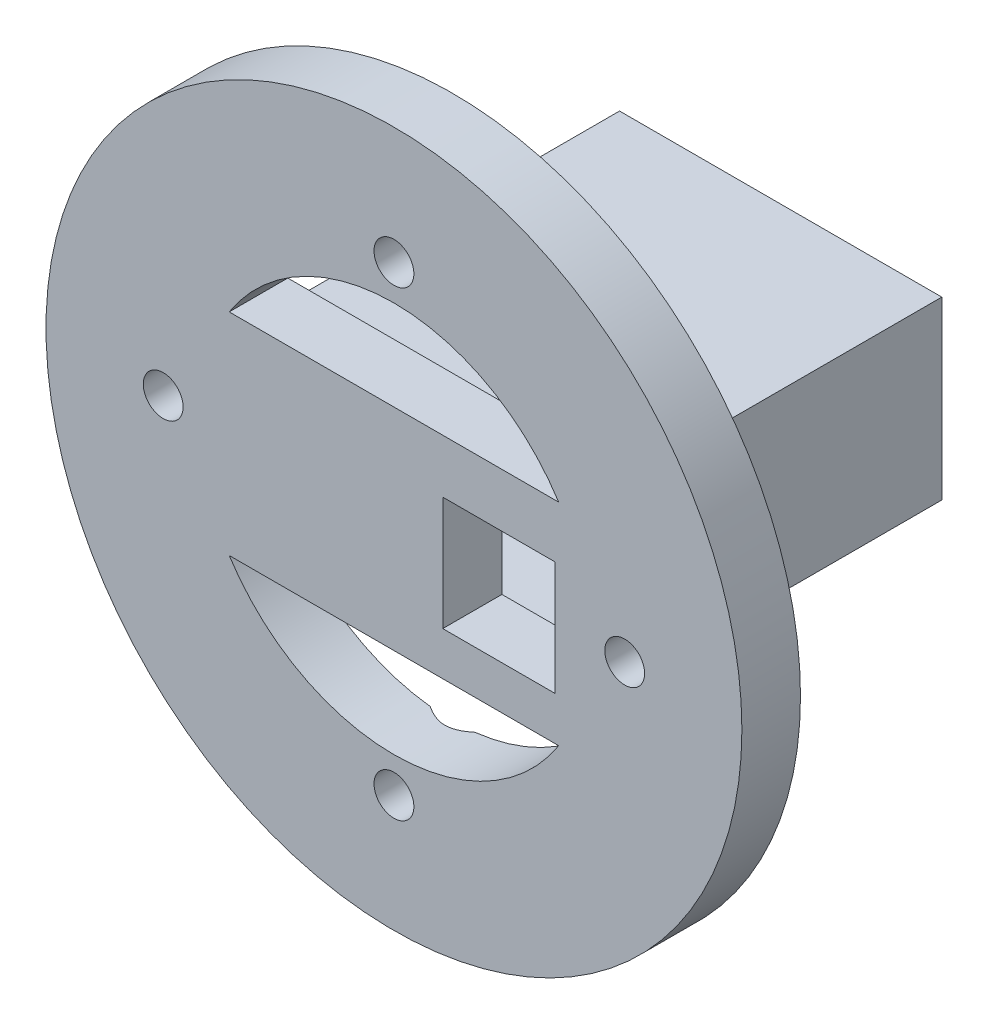
ISO-10303-21;
HEADER;
FILE_DESCRIPTION(('STEP AP214'),'2;1');
FILE_NAME('part.step','',(''),(''),'','','');
FILE_SCHEMA(('AUTOMOTIVE_DESIGN { 1 0 10303 214 1 1 1 1 }'));
ENDSEC;
DATA;
#1=APPLICATION_CONTEXT('core data for automotive mechanical design processes');
#2=APPLICATION_PROTOCOL_DEFINITION('international standard','automotive_design',2000,#1);
#3=PRODUCT_CONTEXT('',#1,'mechanical');
#4=PRODUCT('Part','Part','',(#3));
#5=PRODUCT_RELATED_PRODUCT_CATEGORY('part','',(#4));
#6=PRODUCT_DEFINITION_FORMATION('','',#4);
#7=PRODUCT_DEFINITION_CONTEXT('part definition',#1,'design');
#8=PRODUCT_DEFINITION('design','',#6,#7);
#9=PRODUCT_DEFINITION_SHAPE('','',#8);
#10=(LENGTH_UNIT() NAMED_UNIT(*) SI_UNIT(.MILLI.,.METRE.));
#11=(NAMED_UNIT(*) PLANE_ANGLE_UNIT() SI_UNIT($,.RADIAN.));
#12=(NAMED_UNIT(*) SI_UNIT($,.STERADIAN.) SOLID_ANGLE_UNIT());
#13=UNCERTAINTY_MEASURE_WITH_UNIT(LENGTH_MEASURE(1.E-05),#10,'distance_accuracy_value','');
#14=(GEOMETRIC_REPRESENTATION_CONTEXT(3) GLOBAL_UNCERTAINTY_ASSIGNED_CONTEXT((#13)) GLOBAL_UNIT_ASSIGNED_CONTEXT((#10,
#11,#12)) REPRESENTATION_CONTEXT('',''));
#15=CARTESIAN_POINT('',(0.,0.,0.));
#16=DIRECTION('',(0.,0.,1.));
#17=DIRECTION('',(1.,0.,0.));
#18=AXIS2_PLACEMENT_3D('',#15,#16,#17);
#19=CARTESIAN_POINT('',(13.75,7.5,0.));
#20=DIRECTION('',(-1.,0.,0.));
#21=DIRECTION('',(0.,0.,1.));
#22=AXIS2_PLACEMENT_3D('',#19,#20,#21);
#23=PLANE('',#22);
#24=DIRECTION('',(0.,0.,1.));
#25=VECTOR('',#24,1.);
#26=CARTESIAN_POINT('',(13.75,-5.29266234845059,-13.6995729837994));
#27=LINE('',#26,#25);
#28=CARTESIAN_POINT('',(13.75,-5.29266234845059,-0.050000000000005));
#29=VERTEX_POINT('',#28);
#30=CARTESIAN_POINT('',(13.75,-5.29266234845059,0.));
#31=VERTEX_POINT('',#30);
#32=EDGE_CURVE('E434',#29,#31,#27,.T.);
#33=ORIENTED_EDGE('',*,*,#32,.T.);
#34=DIRECTION('',(0.,-1.,0.));
#35=VECTOR('',#34,1.);
#36=CARTESIAN_POINT('',(13.75,7.5,0.));
#37=LINE('',#36,#35);
#38=CARTESIAN_POINT('',(13.75,-7.5,0.));
#39=VERTEX_POINT('',#38);
#40=EDGE_CURVE('E544',#31,#39,#37,.T.);
#41=ORIENTED_EDGE('',*,*,#40,.T.);
#42=DIRECTION('',(0.,0.,-1.));
#43=VECTOR('',#42,1.);
#44=CARTESIAN_POINT('',(13.75,-7.5,0.));
#45=LINE('',#44,#43);
#46=CARTESIAN_POINT('',(13.75,-7.5,-28.));
#47=VERTEX_POINT('',#46);
#48=EDGE_CURVE('E536',#39,#47,#45,.T.);
#49=ORIENTED_EDGE('',*,*,#48,.T.);
#50=DIRECTION('',(0.,-1.,0.));
#51=VECTOR('',#50,1.);
#52=CARTESIAN_POINT('',(13.75,7.5,-28.));
#53=LINE('',#52,#51);
#54=CARTESIAN_POINT('',(13.75,7.5,-28.));
#55=VERTEX_POINT('',#54);
#56=EDGE_CURVE('E541',#55,#47,#53,.T.);
#57=ORIENTED_EDGE('',*,*,#56,.F.);
#58=DIRECTION('',(0.,0.,-1.));
#59=VECTOR('',#58,1.);
#60=CARTESIAN_POINT('',(13.75,7.5,0.));
#61=LINE('',#60,#59);
#62=CARTESIAN_POINT('',(13.75,7.5,0.));
#63=VERTEX_POINT('',#62);
#64=EDGE_CURVE('E526',#63,#55,#61,.T.);
#65=ORIENTED_EDGE('',*,*,#64,.F.);
#66=CARTESIAN_POINT('',(13.75,4.42501278313102,0.));
#67=VERTEX_POINT('',#66);
#68=EDGE_CURVE('E223',#63,#67,#37,.T.);
#69=ORIENTED_EDGE('',*,*,#68,.T.);
#70=DIRECTION('',(0.,0.,1.));
#71=VECTOR('',#70,1.);
#72=CARTESIAN_POINT('',(13.75,4.42501278313102,-13.6995729837994));
#73=LINE('',#72,#71);
#74=CARTESIAN_POINT('',(13.75,4.42501278313102,-0.0500000000000049));
#75=VERTEX_POINT('',#74);
#76=EDGE_CURVE('E460',#75,#67,#73,.T.);
#77=ORIENTED_EDGE('',*,*,#76,.F.);
#78=DIRECTION('',(0.,-1.,0.));
#79=VECTOR('',#78,1.);
#80=CARTESIAN_POINT('',(13.75,-5.29266234845059,-0.0500000000000049));
#81=LINE('',#80,#79);
#82=EDGE_CURVE('E438',#75,#29,#81,.T.);
#83=ORIENTED_EDGE('',*,*,#82,.T.);
#84=EDGE_LOOP('',(#33,#41,#49,#57,#65,#69,#77,#83));
#85=FACE_BOUND('',#84,.T.);
#86=ADVANCED_FACE('F40',(#85),#23,.F.);
#87=CARTESIAN_POINT('',(-13.75,7.5,-28.));
#88=DIRECTION('',(0.,0.,1.));
#89=DIRECTION('',(1.,0.,0.));
#90=AXIS2_PLACEMENT_3D('',#87,#88,#89);
#91=PLANE('',#90);
#92=DIRECTION('',(-1.,0.,0.));
#93=VECTOR('',#92,1.);
#94=CARTESIAN_POINT('',(-13.75,-7.5,-28.));
#95=LINE('',#94,#93);
#96=CARTESIAN_POINT('',(-13.75,-7.5,-28.));
#97=VERTEX_POINT('',#96);
#98=EDGE_CURVE('E524',#47,#97,#95,.T.);
#99=ORIENTED_EDGE('',*,*,#98,.T.);
#100=DIRECTION('',(0.,-1.,0.));
#101=VECTOR('',#100,1.);
#102=CARTESIAN_POINT('',(-13.75,7.5,-28.));
#103=LINE('',#102,#101);
#104=CARTESIAN_POINT('',(-13.75,7.5,-28.));
#105=VERTEX_POINT('',#104);
#106=EDGE_CURVE('E530',#105,#97,#103,.T.);
#107=ORIENTED_EDGE('',*,*,#106,.F.);
#108=DIRECTION('',(-1.,0.,0.));
#109=VECTOR('',#108,1.);
#110=CARTESIAN_POINT('',(-13.75,7.5,-28.));
#111=LINE('',#110,#109);
#112=EDGE_CURVE('E528',#55,#105,#111,.T.);
#113=ORIENTED_EDGE('',*,*,#112,.F.);
#114=ORIENTED_EDGE('',*,*,#56,.T.);
#115=EDGE_LOOP('',(#99,#107,#113,#114));
#116=FACE_BOUND('',#115,.T.);
#117=DIRECTION('',(0.,-1.,0.));
#118=VECTOR('',#117,1.);
#119=CARTESIAN_POINT('',(-2.25,5.5,-28.));
#120=LINE('',#119,#118);
#121=CARTESIAN_POINT('',(-2.25,5.5,-28.));
#122=VERTEX_POINT('',#121);
#123=CARTESIAN_POINT('',(-2.24999999999999,-5.5,-28.));
#124=VERTEX_POINT('',#123);
#125=EDGE_CURVE('E467',#122,#124,#120,.T.);
#126=ORIENTED_EDGE('',*,*,#125,.T.);
#127=DIRECTION('',(1.,0.,0.));
#128=VECTOR('',#127,1.);
#129=CARTESIAN_POINT('',(-2.24999999999999,-5.5,-28.));
#130=LINE('',#129,#128);
#131=CARTESIAN_POINT('',(9.75000000000001,-5.5,-28.));
#132=VERTEX_POINT('',#131);
#133=EDGE_CURVE('E470',#124,#132,#130,.T.);
#134=ORIENTED_EDGE('',*,*,#133,.T.);
#135=DIRECTION('',(0.,-1.,0.));
#136=VECTOR('',#135,1.);
#137=CARTESIAN_POINT('',(9.75000000000001,5.5,-28.));
#138=LINE('',#137,#136);
#139=CARTESIAN_POINT('',(9.75000000000001,5.5,-28.));
#140=VERTEX_POINT('',#139);
#141=EDGE_CURVE('E473',#140,#132,#138,.T.);
#142=ORIENTED_EDGE('',*,*,#141,.F.);
#143=DIRECTION('',(1.,0.,0.));
#144=VECTOR('',#143,1.);
#145=CARTESIAN_POINT('',(-2.25,5.5,-28.));
#146=LINE('',#145,#144);
#147=EDGE_CURVE('E476',#122,#140,#146,.T.);
#148=ORIENTED_EDGE('',*,*,#147,.F.);
#149=EDGE_LOOP('',(#126,#134,#142,#148));
#150=FACE_BOUND('',#149,.T.);
#151=ADVANCED_FACE('F378',(#116,#150),#91,.F.);
#152=CARTESIAN_POINT('',(0.,0.,0.));
#153=DIRECTION('',(0.,0.,1.));
#154=DIRECTION('',(1.,0.,0.));
#155=AXIS2_PLACEMENT_3D('',#152,#153,#154);
#156=PLANE('',#155);
#157=CARTESIAN_POINT('',(19.6925271830558,0.,0.));
#158=DIRECTION('',(0.,0.,-1.));
#159=DIRECTION('',(-1.,0.,0.));
#160=AXIS2_PLACEMENT_3D('',#157,#158,#159);
#161=CIRCLE('',#160,3.65);
#162=CARTESIAN_POINT('',(16.0425271830558,0.,0.));
#163=VERTEX_POINT('',#162);
#164=EDGE_CURVE('E418',#163,#163,#161,.T.);
#165=ORIENTED_EDGE('',*,*,#164,.F.);
#166=EDGE_LOOP('',(#165));
#167=FACE_BOUND('',#166,.T.);
#168=CARTESIAN_POINT('',(-19.6925271830558,0.,0.));
#169=DIRECTION('',(0.,0.,-1.));
#170=DIRECTION('',(-1.,0.,0.));
#171=AXIS2_PLACEMENT_3D('',#168,#169,#170);
#172=CIRCLE('',#171,3.65);
#173=CARTESIAN_POINT('',(-23.3425271830558,0.,0.));
#174=VERTEX_POINT('',#173);
#175=EDGE_CURVE('E269',#174,#174,#172,.T.);
#176=ORIENTED_EDGE('',*,*,#175,.F.);
#177=EDGE_LOOP('',(#176));
#178=FACE_BOUND('',#177,.T.);
#179=CARTESIAN_POINT('',(0.,0.,0.));
#180=DIRECTION('',(0.,0.,1.));
#181=DIRECTION('',(1.,0.,0.));
#182=AXIS2_PLACEMENT_3D('',#179,#180,#181);
#183=CIRCLE('',#182,29.6925271830558);
#184=CARTESIAN_POINT('',(29.6925271830558,0.,0.));
#185=VERTEX_POINT('',#184);
#186=EDGE_CURVE('E233',#185,#185,#183,.T.);
#187=ORIENTED_EDGE('',*,*,#186,.F.);
#188=EDGE_LOOP('',(#187));
#189=FACE_BOUND('',#188,.T.);
#190=CARTESIAN_POINT('',(0.,0.,0.));
#191=DIRECTION('',(0.,0.,1.));
#192=DIRECTION('',(1.,0.,0.));
#193=AXIS2_PLACEMENT_3D('',#190,#191,#192);
#194=CIRCLE('',#193,16.6925271830558);
#195=CARTESIAN_POINT('',(14.058465910513,9.,0.));
#196=VERTEX_POINT('',#195);
#197=CARTESIAN_POINT('',(1.91100928095911,16.5827774297656,0.));
#198=VERTEX_POINT('',#197);
#199=EDGE_CURVE('E221',#196,#198,#194,.T.);
#200=ORIENTED_EDGE('',*,*,#199,.T.);
#201=CARTESIAN_POINT('',(0.,19.6925271830558,0.));
#202=DIRECTION('',(0.,0.,-1.));
#203=DIRECTION('',(-1.,0.,0.));
#204=AXIS2_PLACEMENT_3D('',#201,#202,#203);
#205=CIRCLE('',#204,3.65);
#206=CARTESIAN_POINT('',(-1.9110092809591,16.5827774297656,0.));
#207=VERTEX_POINT('',#206);
#208=EDGE_CURVE('E61',#207,#198,#205,.T.);
#209=ORIENTED_EDGE('',*,*,#208,.F.);
#210=CARTESIAN_POINT('',(-14.058465910513,9.,0.));
#211=VERTEX_POINT('',#210);
#212=EDGE_CURVE('E219',#207,#211,#194,.T.);
#213=ORIENTED_EDGE('',*,*,#212,.T.);
#214=DIRECTION('',(-1.,0.,0.));
#215=VECTOR('',#214,1.);
#216=CARTESIAN_POINT('',(0.,9.,0.));
#217=LINE('',#216,#215);
#218=EDGE_CURVE('E227',#196,#211,#217,.T.);
#219=ORIENTED_EDGE('',*,*,#218,.F.);
#220=EDGE_LOOP('',(#200,#209,#213,#219));
#221=FACE_BOUND('',#220,.T.);
#222=CARTESIAN_POINT('',(-14.058465910513,-9.,0.));
#223=VERTEX_POINT('',#222);
#224=CARTESIAN_POINT('',(-1.91100928095911,-16.5827774297656,0.));
#225=VERTEX_POINT('',#224);
#226=EDGE_CURVE('E210',#223,#225,#194,.T.);
#227=ORIENTED_EDGE('',*,*,#226,.T.);
#228=CARTESIAN_POINT('',(0.,-19.6925271830558,0.));
#229=DIRECTION('',(0.,0.,-1.));
#230=DIRECTION('',(-1.,0.,0.));
#231=AXIS2_PLACEMENT_3D('',#228,#229,#230);
#232=CIRCLE('',#231,3.65);
#233=CARTESIAN_POINT('',(1.9110092809591,-16.5827774297656,0.));
#234=VERTEX_POINT('',#233);
#235=EDGE_CURVE('E54',#234,#225,#232,.T.);
#236=ORIENTED_EDGE('',*,*,#235,.F.);
#237=CARTESIAN_POINT('',(14.058465910513,-9.,0.));
#238=VERTEX_POINT('',#237);
#239=EDGE_CURVE('E208',#234,#238,#194,.T.);
#240=ORIENTED_EDGE('',*,*,#239,.T.);
#241=DIRECTION('',(-1.,0.,0.));
#242=VECTOR('',#241,1.);
#243=CARTESIAN_POINT('',(0.,-9.,0.));
#244=LINE('',#243,#242);
#245=EDGE_CURVE('E220',#238,#223,#244,.T.);
#246=ORIENTED_EDGE('',*,*,#245,.T.);
#247=EDGE_LOOP('',(#227,#236,#240,#246));
#248=FACE_BOUND('',#247,.T.);
#249=DIRECTION('',(1.,0.,0.));
#250=VECTOR('',#249,1.);
#251=CARTESIAN_POINT('',(-13.75,7.5,0.));
#252=LINE('',#251,#250);
#253=CARTESIAN_POINT('',(-13.75,7.5,0.));
#254=VERTEX_POINT('',#253);
#255=EDGE_CURVE('E523',#254,#63,#252,.T.);
#256=ORIENTED_EDGE('',*,*,#255,.F.);
#257=DIRECTION('',(0.,-1.,0.));
#258=VECTOR('',#257,1.);
#259=CARTESIAN_POINT('',(-13.75,7.5,0.));
#260=LINE('',#259,#258);
#261=CARTESIAN_POINT('',(-13.75,-7.5,0.));
#262=VERTEX_POINT('',#261);
#263=EDGE_CURVE('E217',#254,#262,#260,.T.);
#264=ORIENTED_EDGE('',*,*,#263,.T.);
#265=DIRECTION('',(1.,0.,0.));
#266=VECTOR('',#265,1.);
#267=CARTESIAN_POINT('',(-13.75,-7.5,0.));
#268=LINE('',#267,#266);
#269=EDGE_CURVE('E533',#262,#39,#268,.T.);
#270=ORIENTED_EDGE('',*,*,#269,.T.);
#271=ORIENTED_EDGE('',*,*,#40,.F.);
#272=EDGE_CURVE('E546',#67,#31,#37,.T.);
#273=ORIENTED_EDGE('',*,*,#272,.F.);
#274=ORIENTED_EDGE('',*,*,#68,.F.);
#275=EDGE_LOOP('',(#256,#264,#270,#271,#273,#274));
#276=FACE_BOUND('',#275,.T.);
#277=ADVANCED_FACE('F205',(#167,#178,#189,#221,#248,#276),#156,.F.);
#278=CARTESIAN_POINT('',(0.,9.,5.));
#279=DIRECTION('',(0.,-1.,0.));
#280=DIRECTION('',(0.,0.,-1.));
#281=AXIS2_PLACEMENT_3D('',#278,#279,#280);
#282=PLANE('',#281);
#283=ORIENTED_EDGE('',*,*,#218,.T.);
#284=DIRECTION('',(0.,0.,-1.));
#285=VECTOR('',#284,1.);
#286=CARTESIAN_POINT('',(-14.058465910513,9.,5.));
#287=LINE('',#286,#285);
#288=CARTESIAN_POINT('',(-14.058465910513,9.,5.));
#289=VERTEX_POINT('',#288);
#290=EDGE_CURVE('E244',#289,#211,#287,.T.);
#291=ORIENTED_EDGE('',*,*,#290,.F.);
#292=DIRECTION('',(-1.,0.,0.));
#293=VECTOR('',#292,1.);
#294=CARTESIAN_POINT('',(0.,9.,5.));
#295=LINE('',#294,#293);
#296=CARTESIAN_POINT('',(14.058465910513,9.,5.));
#297=VERTEX_POINT('',#296);
#298=EDGE_CURVE('E553',#297,#289,#295,.T.);
#299=ORIENTED_EDGE('',*,*,#298,.F.);
#300=DIRECTION('',(0.,0.,-1.));
#301=VECTOR('',#300,1.);
#302=CARTESIAN_POINT('',(14.058465910513,9.,5.));
#303=LINE('',#302,#301);
#304=EDGE_CURVE('E242',#297,#196,#303,.T.);
#305=ORIENTED_EDGE('',*,*,#304,.T.);
#306=EDGE_LOOP('',(#283,#291,#299,#305));
#307=FACE_BOUND('',#306,.T.);
#308=ADVANCED_FACE('F394',(#307),#282,.F.);
#309=CARTESIAN_POINT('',(0.,0.,5.));
#310=DIRECTION('',(0.,0.,-1.));
#311=DIRECTION('',(-1.,0.,0.));
#312=AXIS2_PLACEMENT_3D('',#309,#310,#311);
#313=CYLINDRICAL_SURFACE('',#312,16.6925271830558);
#314=CARTESIAN_POINT('',(-1.9113309362851,-16.5827403588507,-0.000200000000004162));
#315=CARTESIAN_POINT('',(-1.81686091365664,-16.5936233985878,0.0584766541803595));
#316=CARTESIAN_POINT('',(-1.72097131663076,-16.6038629712685,0.115170780609948));
#317=CARTESIAN_POINT('',(-1.52556110971892,-16.6229617781007,0.223237189031636));
#318=CARTESIAN_POINT('',(-1.42602624929648,-16.6318146715409,0.274584684203519));
#319=CARTESIAN_POINT('',(-1.2216407447067,-16.6480849234389,0.370863945211368));
#320=CARTESIAN_POINT('',(-1.11672842084012,-16.6554752499797,0.415671478334215));
#321=CARTESIAN_POINT('',(-0.903231739312144,-16.668414320142,0.495435220101385));
#322=CARTESIAN_POINT('',(-0.794654260729581,-16.6739663230564,0.530408847178778));
#323=CARTESIAN_POINT('',(-0.61130885402256,-16.6814904742954,0.578347626576983));
#324=CARTESIAN_POINT('',(-0.537464015795013,-16.6840385557379,0.594758272183346));
#325=CARTESIAN_POINT('',(-0.388631656706374,-16.6881684709717,0.621494007727298));
#326=CARTESIAN_POINT('',(-0.313644093229515,-16.6897502686365,0.631818870134608));
#327=CARTESIAN_POINT('',(-0.163685777336905,-16.6918915673055,0.645822342970473));
#328=CARTESIAN_POINT('',(-0.0887205248400777,-16.6924598196453,0.649557845314312));
#329=CARTESIAN_POINT('',(0.061244452077949,-16.6925832399892,0.650367937442892));
#330=CARTESIAN_POINT('',(0.136244175175957,-16.6921384440834,0.647442764515727));
#331=CARTESIAN_POINT('',(0.285531855767716,-16.6902515247844,0.635093079720591));
#332=CARTESIAN_POINT('',(0.359820967616169,-16.6888114736635,0.625682072457935));
#333=CARTESIAN_POINT('',(0.50736993766545,-16.6849781668815,0.600824397734757));
#334=CARTESIAN_POINT('',(0.580629278009699,-16.6825844482234,0.58537479866003));
#335=CARTESIAN_POINT('',(0.799412123210846,-16.6740151973533,0.530636584719311));
#336=CARTESIAN_POINT('',(0.942850273604912,-16.666466628122,0.483063985852225));
#337=CARTESIAN_POINT('',(1.15581328323094,-16.6526256802617,0.398482682279618));
#338=CARTESIAN_POINT('',(1.22788865339922,-16.6474582033497,0.367297725160783));
#339=CARTESIAN_POINT('',(1.37031648959177,-16.6363394324341,0.301261733159231));
#340=CARTESIAN_POINT('',(1.44066853782494,-16.6303879505487,0.266409819917972));
#341=CARTESIAN_POINT('',(1.57859723388736,-16.6178584729172,0.194264412401833));
#342=CARTESIAN_POINT('',(1.6462002542226,-16.6112919881478,0.157018745207216));
#343=CARTESIAN_POINT('',(1.77986779505781,-16.5975007148304,0.0801100011354145));
#344=CARTESIAN_POINT('',(1.84593368283373,-16.5902765417837,0.0404491957602694));
#345=CARTESIAN_POINT('',(1.9113309362851,-16.5827403588507,-0.000200000000000226));
#346=B_SPLINE_CURVE_WITH_KNOTS('',3,(#314,#315,#316,#317,#318,#319,#320,#321,#322,#323,#324,
#325,#326,#327,#328,#329,#330,#331,#332,#333,#334,#335,#336,#337,#338,#339,#340,#341,#342,#343,
#344,#345),.UNSPECIFIED.,.F.,.F.,(4,2,2,2,2,2,2,2,2,2,2,2,2,2,2,4),(0.,0.335340175629545,
0.672171574818139,1.01474255400468,1.35670287163246,1.58354538539434,1.81039637962052,
2.035278996569,2.26015360214772,2.48456138977357,2.7090782584331,3.16136186214135,
3.39740583511213,3.63350647778132,3.86584015587305,4.09795859548116),.UNSPECIFIED.);
#347=EDGE_CURVE('E11',#225,#234,#346,.T.);
#348=ORIENTED_EDGE('',*,*,#347,.F.);
#349=ORIENTED_EDGE('',*,*,#226,.F.);
#350=DIRECTION('',(0.,0.,-1.));
#351=VECTOR('',#350,1.);
#352=CARTESIAN_POINT('',(-14.058465910513,-9.,5.));
#353=LINE('',#352,#351);
#354=CARTESIAN_POINT('',(-14.058465910513,-9.,5.));
#355=VERTEX_POINT('',#354);
#356=EDGE_CURVE('E245',#355,#223,#353,.T.);
#357=ORIENTED_EDGE('',*,*,#356,.F.);
#358=CARTESIAN_POINT('',(0.,0.,5.));
#359=DIRECTION('',(0.,0.,1.));
#360=DIRECTION('',(1.,0.,0.));
#361=AXIS2_PLACEMENT_3D('',#358,#359,#360);
#362=CIRCLE('',#361,16.6925271830558);
#363=CARTESIAN_POINT('',(14.058465910513,-9.,5.));
#364=VERTEX_POINT('',#363);
#365=EDGE_CURVE('E241',#355,#364,#362,.T.);
#366=ORIENTED_EDGE('',*,*,#365,.T.);
#367=DIRECTION('',(0.,0.,-1.));
#368=VECTOR('',#367,1.);
#369=CARTESIAN_POINT('',(14.058465910513,-9.,5.));
#370=LINE('',#369,#368);
#371=EDGE_CURVE('E215',#364,#238,#370,.T.);
#372=ORIENTED_EDGE('',*,*,#371,.T.);
#373=ORIENTED_EDGE('',*,*,#239,.F.);
#374=EDGE_LOOP('',(#348,#349,#357,#366,#372,#373));
#375=FACE_BOUND('',#374,.T.);
#376=ADVANCED_FACE('F213',(#375),#313,.F.);
#377=CARTESIAN_POINT('',(1.9113309362851,16.5827403588507,-0.000200000000001023));
#378=CARTESIAN_POINT('',(1.81686091365663,16.5936233985878,0.0584766541803623));
#379=CARTESIAN_POINT('',(1.72097131663075,16.6038629712685,0.115170780609951));
#380=CARTESIAN_POINT('',(1.52556110971891,16.6229617781007,0.223237189031639));
#381=CARTESIAN_POINT('',(1.42602624929648,16.6318146715409,0.274584684203522));
#382=CARTESIAN_POINT('',(1.2216407447067,16.6480849234389,0.37086394521137));
#383=CARTESIAN_POINT('',(1.11672842084012,16.6554752499797,0.415671478334218));
#384=CARTESIAN_POINT('',(0.903231739312139,16.668414320142,0.495435220101387));
#385=CARTESIAN_POINT('',(0.794654260729575,16.6739663230564,0.53040884717878));
#386=CARTESIAN_POINT('',(0.611308854022554,16.6814904742954,0.578347626576984));
#387=CARTESIAN_POINT('',(0.537464015795007,16.6840385557379,0.594758272183347));
#388=CARTESIAN_POINT('',(0.388631656706367,16.6881684709717,0.621494007727299));
#389=CARTESIAN_POINT('',(0.313644093229509,16.6897502686365,0.631818870134608));
#390=CARTESIAN_POINT('',(0.163685777336899,16.6918915673055,0.645822342970474));
#391=CARTESIAN_POINT('',(0.0887205248400715,16.6924598196453,0.649557845314316));
#392=CARTESIAN_POINT('',(-0.061244452077955,16.6925832399892,0.650367937442896));
#393=CARTESIAN_POINT('',(-0.136244175175963,16.6921384440834,0.647442764515727));
#394=CARTESIAN_POINT('',(-0.285531855767722,16.6902515247844,0.635093079720589));
#395=CARTESIAN_POINT('',(-0.359820967616175,16.6888114736635,0.625682072457934));
#396=CARTESIAN_POINT('',(-0.507369937665456,16.6849781668815,0.600824397734756));
#397=CARTESIAN_POINT('',(-0.580629278009704,16.6825844482234,0.585374798660029));
#398=CARTESIAN_POINT('',(-0.799412123210851,16.6740151973533,0.53063658471931));
#399=CARTESIAN_POINT('',(-0.942850273604917,16.666466628122,0.483063985852223));
#400=CARTESIAN_POINT('',(-1.15581328323095,16.6526256802617,0.398482682279616));
#401=CARTESIAN_POINT('',(-1.22788865339923,16.6474582033497,0.367297725160781));
#402=CARTESIAN_POINT('',(-1.37031648959177,16.6363394324341,0.301261733159229));
#403=CARTESIAN_POINT('',(-1.44066853782495,16.6303879505487,0.26640981991797));
#404=CARTESIAN_POINT('',(-1.57859723388736,16.6178584729172,0.194264412401831));
#405=CARTESIAN_POINT('',(-1.64620025422261,16.6112919881478,0.157018745207214));
#406=CARTESIAN_POINT('',(-1.77986779505782,16.5975007148304,0.0801100011354116));
#407=CARTESIAN_POINT('',(-1.84593368283373,16.5902765417837,0.0404491957602662));
#408=CARTESIAN_POINT('',(-1.9113309362851,16.5827403588507,-0.000200000000003693));
#409=B_SPLINE_CURVE_WITH_KNOTS('',3,(#377,#378,#379,#380,#381,#382,#383,#384,#385,#386,#387,
#388,#389,#390,#391,#392,#393,#394,#395,#396,#397,#398,#399,#400,#401,#402,#403,#404,#405,#406,
#407,#408),.UNSPECIFIED.,.F.,.F.,(4,2,2,2,2,2,2,2,2,2,2,2,2,2,2,4),(0.,0.335340175629545,
0.672171574818138,1.01474255400468,1.35670287163246,1.58354538539433,1.81039637962051,
2.035278996569,2.26015360214772,2.48456138977357,2.7090782584331,3.16136186214135,
3.39740583511212,3.63350647778132,3.86584015587305,4.09795859548116),.UNSPECIFIED.);
#410=EDGE_CURVE('E49',#198,#207,#409,.T.);
#411=ORIENTED_EDGE('',*,*,#410,.F.);
#412=ORIENTED_EDGE('',*,*,#199,.F.);
#413=ORIENTED_EDGE('',*,*,#304,.F.);
#414=EDGE_CURVE('E550',#297,#289,#362,.T.);
#415=ORIENTED_EDGE('',*,*,#414,.T.);
#416=ORIENTED_EDGE('',*,*,#290,.T.);
#417=ORIENTED_EDGE('',*,*,#212,.F.);
#418=EDGE_LOOP('',(#411,#412,#413,#415,#416,#417));
#419=FACE_BOUND('',#418,.T.);
#420=ADVANCED_FACE('F279',(#419),#313,.F.);
#421=CARTESIAN_POINT('',(0.,-9.,5.));
#422=DIRECTION('',(0.,-1.,0.));
#423=DIRECTION('',(0.,0.,-1.));
#424=AXIS2_PLACEMENT_3D('',#421,#422,#423);
#425=PLANE('',#424);
#426=ORIENTED_EDGE('',*,*,#245,.F.);
#427=ORIENTED_EDGE('',*,*,#371,.F.);
#428=DIRECTION('',(-1.,0.,0.));
#429=VECTOR('',#428,1.);
#430=CARTESIAN_POINT('',(0.,-9.,5.));
#431=LINE('',#430,#429);
#432=EDGE_CURVE('E549',#364,#355,#431,.T.);
#433=ORIENTED_EDGE('',*,*,#432,.T.);
#434=ORIENTED_EDGE('',*,*,#356,.T.);
#435=EDGE_LOOP('',(#426,#427,#433,#434));
#436=FACE_BOUND('',#435,.T.);
#437=ADVANCED_FACE('F42',(#436),#425,.T.);
#438=CARTESIAN_POINT('',(0.,0.,5.));
#439=DIRECTION('',(0.,0.,-1.));
#440=DIRECTION('',(-1.,0.,0.));
#441=AXIS2_PLACEMENT_3D('',#438,#439,#440);
#442=CYLINDRICAL_SURFACE('',#441,29.6925271830558);
#443=CARTESIAN_POINT('',(0.,0.,5.));
#444=DIRECTION('',(0.,0.,1.));
#445=DIRECTION('',(1.,0.,0.));
#446=AXIS2_PLACEMENT_3D('',#443,#444,#445);
#447=CIRCLE('',#446,29.6925271830558);
#448=CARTESIAN_POINT('',(29.6925271830558,0.,5.));
#449=VERTEX_POINT('',#448);
#450=EDGE_CURVE('E249',#449,#449,#447,.T.);
#451=ORIENTED_EDGE('',*,*,#450,.F.);
#452=EDGE_LOOP('',(#451));
#453=FACE_BOUND('',#452,.T.);
#454=ORIENTED_EDGE('',*,*,#186,.T.);
#455=EDGE_LOOP('',(#454));
#456=FACE_BOUND('',#455,.T.);
#457=ADVANCED_FACE('F391',(#453,#456),#442,.T.);
#458=CARTESIAN_POINT('',(0.,0.,5.));
#459=DIRECTION('',(0.,0.,1.));
#460=DIRECTION('',(1.,0.,0.));
#461=AXIS2_PLACEMENT_3D('',#458,#459,#460);
#462=PLANE('',#461);
#463=CARTESIAN_POINT('',(0.,-19.6925271830558,5.));
#464=DIRECTION('',(0.,0.,1.));
#465=DIRECTION('',(1.,0.,0.));
#466=AXIS2_PLACEMENT_3D('',#463,#464,#465);
#467=CIRCLE('',#466,1.69999999999999);
#468=CARTESIAN_POINT('',(1.69999999999999,-19.6925271830558,5.));
#469=VERTEX_POINT('',#468);
#470=EDGE_CURVE('E44',#469,#469,#467,.T.);
#471=ORIENTED_EDGE('',*,*,#470,.F.);
#472=EDGE_LOOP('',(#471));
#473=FACE_BOUND('',#472,.T.);
#474=CARTESIAN_POINT('',(0.,19.6925271830558,5.));
#475=DIRECTION('',(0.,0.,1.));
#476=DIRECTION('',(1.,0.,0.));
#477=AXIS2_PLACEMENT_3D('',#474,#475,#476);
#478=CIRCLE('',#477,1.69999999999999);
#479=CARTESIAN_POINT('',(1.69999999999999,19.6925271830558,5.));
#480=VERTEX_POINT('',#479);
#481=EDGE_CURVE('E278',#480,#480,#478,.T.);
#482=ORIENTED_EDGE('',*,*,#481,.F.);
#483=EDGE_LOOP('',(#482));
#484=FACE_BOUND('',#483,.T.);
#485=CARTESIAN_POINT('',(19.6925271830558,0.,5.));
#486=DIRECTION('',(0.,0.,1.));
#487=DIRECTION('',(1.,0.,0.));
#488=AXIS2_PLACEMENT_3D('',#485,#486,#487);
#489=CIRCLE('',#488,1.69999999999999);
#490=CARTESIAN_POINT('',(21.3925271830558,0.,5.));
#491=VERTEX_POINT('',#490);
#492=EDGE_CURVE('E266',#491,#491,#489,.T.);
#493=ORIENTED_EDGE('',*,*,#492,.F.);
#494=EDGE_LOOP('',(#493));
#495=FACE_BOUND('',#494,.T.);
#496=CARTESIAN_POINT('',(-19.6925271830558,0.,5.));
#497=DIRECTION('',(0.,0.,1.));
#498=DIRECTION('',(1.,0.,0.));
#499=AXIS2_PLACEMENT_3D('',#496,#497,#498);
#500=CIRCLE('',#499,1.69999999999999);
#501=CARTESIAN_POINT('',(-17.9925271830558,0.,5.));
#502=VERTEX_POINT('',#501);
#503=EDGE_CURVE('E261',#502,#502,#500,.T.);
#504=ORIENTED_EDGE('',*,*,#503,.F.);
#505=EDGE_LOOP('',(#504));
#506=FACE_BOUND('',#505,.T.);
#507=DIRECTION('',(0.,1.,0.));
#508=VECTOR('',#507,1.);
#509=CARTESIAN_POINT('',(13.75,-5.29266234845059,5.));
#510=LINE('',#509,#508);
#511=CARTESIAN_POINT('',(13.75,-5.29266234845059,5.));
#512=VERTEX_POINT('',#511);
#513=CARTESIAN_POINT('',(13.75,4.42501278313102,5.));
#514=VERTEX_POINT('',#513);
#515=EDGE_CURVE('E264',#512,#514,#510,.T.);
#516=ORIENTED_EDGE('',*,*,#515,.F.);
#517=DIRECTION('',(-1.,0.,0.));
#518=VECTOR('',#517,1.);
#519=CARTESIAN_POINT('',(13.75,-5.29266234845059,5.));
#520=LINE('',#519,#518);
#521=CARTESIAN_POINT('',(4.16471791353497,-5.29266234845059,5.));
#522=VERTEX_POINT('',#521);
#523=EDGE_CURVE('E449',#512,#522,#520,.T.);
#524=ORIENTED_EDGE('',*,*,#523,.T.);
#525=DIRECTION('',(0.,1.,0.));
#526=VECTOR('',#525,1.);
#527=CARTESIAN_POINT('',(4.16471791353497,-5.29266234845059,5.));
#528=LINE('',#527,#526);
#529=CARTESIAN_POINT('',(4.16471791353497,4.42501278313102,5.));
#530=VERTEX_POINT('',#529);
#531=EDGE_CURVE('E446',#522,#530,#528,.T.);
#532=ORIENTED_EDGE('',*,*,#531,.T.);
#533=DIRECTION('',(-1.,0.,0.));
#534=VECTOR('',#533,1.);
#535=CARTESIAN_POINT('',(13.75,4.42501278313102,5.));
#536=LINE('',#535,#534);
#537=EDGE_CURVE('E443',#514,#530,#536,.T.);
#538=ORIENTED_EDGE('',*,*,#537,.F.);
#539=EDGE_LOOP('',(#516,#524,#532,#538));
#540=FACE_BOUND('',#539,.T.);
#541=ORIENTED_EDGE('',*,*,#365,.F.);
#542=ORIENTED_EDGE('',*,*,#432,.F.);
#543=EDGE_LOOP('',(#541,#542));
#544=FACE_BOUND('',#543,.T.);
#545=ORIENTED_EDGE('',*,*,#298,.T.);
#546=ORIENTED_EDGE('',*,*,#414,.F.);
#547=EDGE_LOOP('',(#545,#546));
#548=FACE_BOUND('',#547,.T.);
#549=ORIENTED_EDGE('',*,*,#450,.T.);
#550=EDGE_LOOP('',(#549));
#551=FACE_BOUND('',#550,.T.);
#552=ADVANCED_FACE('F387',(#473,#484,#495,#506,#540,#544,#548,#551),#462,.T.);
#553=CARTESIAN_POINT('',(-13.75,7.5,0.));
#554=DIRECTION('',(1.,0.,0.));
#555=DIRECTION('',(0.,0.,-1.));
#556=AXIS2_PLACEMENT_3D('',#553,#554,#555);
#557=PLANE('',#556);
#558=DIRECTION('',(0.,0.,1.));
#559=VECTOR('',#558,1.);
#560=CARTESIAN_POINT('',(-13.75,-7.5,0.));
#561=LINE('',#560,#559);
#562=EDGE_CURVE('E512',#97,#262,#561,.T.);
#563=ORIENTED_EDGE('',*,*,#562,.T.);
#564=ORIENTED_EDGE('',*,*,#263,.F.);
#565=DIRECTION('',(0.,0.,1.));
#566=VECTOR('',#565,1.);
#567=CARTESIAN_POINT('',(-13.75,7.5,0.));
#568=LINE('',#567,#566);
#569=EDGE_CURVE('E521',#105,#254,#568,.T.);
#570=ORIENTED_EDGE('',*,*,#569,.F.);
#571=ORIENTED_EDGE('',*,*,#106,.T.);
#572=EDGE_LOOP('',(#563,#564,#570,#571));
#573=FACE_BOUND('',#572,.T.);
#574=ADVANCED_FACE('F373',(#573),#557,.F.);
#575=CARTESIAN_POINT('',(0.,7.5,0.));
#576=DIRECTION('',(0.,-1.,0.));
#577=DIRECTION('',(0.,0.,-1.));
#578=AXIS2_PLACEMENT_3D('',#575,#576,#577);
#579=PLANE('',#578);
#580=ORIENTED_EDGE('',*,*,#569,.T.);
#581=ORIENTED_EDGE('',*,*,#255,.T.);
#582=ORIENTED_EDGE('',*,*,#64,.T.);
#583=ORIENTED_EDGE('',*,*,#112,.T.);
#584=EDGE_LOOP('',(#580,#581,#582,#583));
#585=FACE_BOUND('',#584,.T.);
#586=ADVANCED_FACE('F370',(#585),#579,.F.);
#587=CARTESIAN_POINT('',(0.,-7.5,0.));
#588=DIRECTION('',(0.,-1.,0.));
#589=DIRECTION('',(0.,0.,-1.));
#590=AXIS2_PLACEMENT_3D('',#587,#588,#589);
#591=PLANE('',#590);
#592=ORIENTED_EDGE('',*,*,#562,.F.);
#593=ORIENTED_EDGE('',*,*,#98,.F.);
#594=ORIENTED_EDGE('',*,*,#48,.F.);
#595=ORIENTED_EDGE('',*,*,#269,.F.);
#596=EDGE_LOOP('',(#592,#593,#594,#595));
#597=FACE_BOUND('',#596,.T.);
#598=ADVANCED_FACE('F346',(#597),#591,.T.);
#599=CARTESIAN_POINT('',(-2.25,5.5,-25.));
#600=DIRECTION('',(1.,0.,0.));
#601=DIRECTION('',(0.,1.,0.));
#602=AXIS2_PLACEMENT_3D('',#599,#600,#601);
#603=PLANE('',#602);
#604=DIRECTION('',(0.,0.,-1.));
#605=VECTOR('',#604,1.);
#606=CARTESIAN_POINT('',(-2.24999999999999,-5.5,-25.));
#607=LINE('',#606,#605);
#608=CARTESIAN_POINT('',(-2.24999999999999,-5.5,-25.5));
#609=VERTEX_POINT('',#608);
#610=EDGE_CURVE('E486',#609,#124,#607,.T.);
#611=ORIENTED_EDGE('',*,*,#610,.T.);
#612=ORIENTED_EDGE('',*,*,#125,.F.);
#613=DIRECTION('',(0.,0.,-1.));
#614=VECTOR('',#613,1.);
#615=CARTESIAN_POINT('',(-2.25,5.5,-25.));
#616=LINE('',#615,#614);
#617=CARTESIAN_POINT('',(-2.25,5.5,-25.5));
#618=VERTEX_POINT('',#617);
#619=EDGE_CURVE('E479',#618,#122,#616,.T.);
#620=ORIENTED_EDGE('',*,*,#619,.F.);
#621=DIRECTION('',(0.,1.,0.));
#622=VECTOR('',#621,1.);
#623=CARTESIAN_POINT('',(-2.24999999999999,-6.1,-25.5));
#624=LINE('',#623,#622);
#625=EDGE_CURVE('E258',#609,#618,#624,.T.);
#626=ORIENTED_EDGE('',*,*,#625,.F.);
#627=EDGE_LOOP('',(#611,#612,#620,#626));
#628=FACE_BOUND('',#627,.T.);
#629=ADVANCED_FACE('F342',(#628),#603,.T.);
#630=CARTESIAN_POINT('',(-2.24999999999999,-5.5,-25.));
#631=DIRECTION('',(0.,1.,0.));
#632=DIRECTION('',(-1.,0.,0.));
#633=AXIS2_PLACEMENT_3D('',#630,#631,#632);
#634=PLANE('',#633);
#635=DIRECTION('',(0.,0.,-1.));
#636=VECTOR('',#635,1.);
#637=CARTESIAN_POINT('',(9.75000000000001,-5.5,-25.));
#638=LINE('',#637,#636);
#639=CARTESIAN_POINT('',(9.75000000000001,-5.5,-25.5));
#640=VERTEX_POINT('',#639);
#641=EDGE_CURVE('E484',#640,#132,#638,.T.);
#642=ORIENTED_EDGE('',*,*,#641,.T.);
#643=ORIENTED_EDGE('',*,*,#133,.F.);
#644=ORIENTED_EDGE('',*,*,#610,.F.);
#645=DIRECTION('',(-1.,0.,0.));
#646=VECTOR('',#645,1.);
#647=CARTESIAN_POINT('',(-11.75,-5.5,-25.5));
#648=LINE('',#647,#646);
#649=EDGE_CURVE('E255',#640,#609,#648,.T.);
#650=ORIENTED_EDGE('',*,*,#649,.F.);
#651=EDGE_LOOP('',(#642,#643,#644,#650));
#652=FACE_BOUND('',#651,.T.);
#653=ADVANCED_FACE('F338',(#652),#634,.T.);
#654=CARTESIAN_POINT('',(9.75000000000001,5.5,-25.));
#655=DIRECTION('',(1.,0.,0.));
#656=DIRECTION('',(0.,1.,0.));
#657=AXIS2_PLACEMENT_3D('',#654,#655,#656);
#658=PLANE('',#657);
#659=DIRECTION('',(0.,1.,0.));
#660=VECTOR('',#659,1.);
#661=CARTESIAN_POINT('',(9.75000000000001,-6.1,-25.5));
#662=LINE('',#661,#660);
#663=CARTESIAN_POINT('',(9.75,5.5,-25.5));
#664=VERTEX_POINT('',#663);
#665=EDGE_CURVE('E252',#640,#664,#662,.T.);
#666=ORIENTED_EDGE('',*,*,#665,.T.);
#667=DIRECTION('',(0.,0.,-1.));
#668=VECTOR('',#667,1.);
#669=CARTESIAN_POINT('',(9.75000000000001,5.5,-25.));
#670=LINE('',#669,#668);
#671=EDGE_CURVE('E482',#664,#140,#670,.T.);
#672=ORIENTED_EDGE('',*,*,#671,.T.);
#673=ORIENTED_EDGE('',*,*,#141,.T.);
#674=ORIENTED_EDGE('',*,*,#641,.F.);
#675=EDGE_LOOP('',(#666,#672,#673,#674));
#676=FACE_BOUND('',#675,.T.);
#677=ADVANCED_FACE('F334',(#676),#658,.F.);
#678=CARTESIAN_POINT('',(-2.25,5.5,-25.));
#679=DIRECTION('',(0.,1.,0.));
#680=DIRECTION('',(-1.,0.,0.));
#681=AXIS2_PLACEMENT_3D('',#678,#679,#680);
#682=PLANE('',#681);
#683=DIRECTION('',(-1.,0.,0.));
#684=VECTOR('',#683,1.);
#685=CARTESIAN_POINT('',(-11.75,5.5,-25.5));
#686=LINE('',#685,#684);
#687=EDGE_CURVE('E247',#664,#618,#686,.T.);
#688=ORIENTED_EDGE('',*,*,#687,.T.);
#689=ORIENTED_EDGE('',*,*,#619,.T.);
#690=ORIENTED_EDGE('',*,*,#147,.T.);
#691=ORIENTED_EDGE('',*,*,#671,.F.);
#692=EDGE_LOOP('',(#688,#689,#690,#691));
#693=FACE_BOUND('',#692,.T.);
#694=ADVANCED_FACE('F330',(#693),#682,.F.);
#695=CARTESIAN_POINT('',(-11.75,-6.1,-25.5));
#696=DIRECTION('',(0.,0.,1.));
#697=DIRECTION('',(1.,0.,0.));
#698=AXIS2_PLACEMENT_3D('',#695,#696,#697);
#699=PLANE('',#698);
#700=DIRECTION('',(1.,0.,0.));
#701=VECTOR('',#700,1.);
#702=CARTESIAN_POINT('',(-11.75,6.1,-25.5));
#703=LINE('',#702,#701);
#704=CARTESIAN_POINT('',(-11.75,6.1,-25.5));
#705=VERTEX_POINT('',#704);
#706=CARTESIAN_POINT('',(11.75,6.1,-25.5));
#707=VERTEX_POINT('',#706);
#708=EDGE_CURVE('E506',#705,#707,#703,.T.);
#709=ORIENTED_EDGE('',*,*,#708,.F.);
#710=DIRECTION('',(0.,1.,0.));
#711=VECTOR('',#710,1.);
#712=CARTESIAN_POINT('',(-11.75,-6.1,-25.5));
#713=LINE('',#712,#711);
#714=CARTESIAN_POINT('',(-11.75,-6.1,-25.5));
#715=VERTEX_POINT('',#714);
#716=EDGE_CURVE('E513',#715,#705,#713,.T.);
#717=ORIENTED_EDGE('',*,*,#716,.F.);
#718=DIRECTION('',(1.,0.,0.));
#719=VECTOR('',#718,1.);
#720=CARTESIAN_POINT('',(-11.75,-6.1,-25.5));
#721=LINE('',#720,#719);
#722=CARTESIAN_POINT('',(11.75,-6.1,-25.5));
#723=VERTEX_POINT('',#722);
#724=EDGE_CURVE('E496',#715,#723,#721,.T.);
#725=ORIENTED_EDGE('',*,*,#724,.T.);
#726=DIRECTION('',(0.,1.,0.));
#727=VECTOR('',#726,1.);
#728=CARTESIAN_POINT('',(11.75,-6.1,-25.5));
#729=LINE('',#728,#727);
#730=EDGE_CURVE('E516',#723,#707,#729,.T.);
#731=ORIENTED_EDGE('',*,*,#730,.T.);
#732=EDGE_LOOP('',(#709,#717,#725,#731));
#733=FACE_BOUND('',#732,.T.);
#734=ORIENTED_EDGE('',*,*,#649,.T.);
#735=ORIENTED_EDGE('',*,*,#625,.T.);
#736=ORIENTED_EDGE('',*,*,#687,.F.);
#737=ORIENTED_EDGE('',*,*,#665,.F.);
#738=EDGE_LOOP('',(#734,#735,#736,#737));
#739=FACE_BOUND('',#738,.T.);
#740=ADVANCED_FACE('F333',(#733,#739),#699,.T.);
#741=CARTESIAN_POINT('',(-11.75,-6.1,-0.0500000000000036));
#742=DIRECTION('',(0.,0.,1.));
#743=DIRECTION('',(1.,0.,0.));
#744=AXIS2_PLACEMENT_3D('',#741,#742,#743);
#745=PLANE('',#744);
#746=DIRECTION('',(0.,-1.,0.));
#747=VECTOR('',#746,1.);
#748=CARTESIAN_POINT('',(4.16471791353497,-5.29266234845059,-0.0500000000000049));
#749=LINE('',#748,#747);
#750=CARTESIAN_POINT('',(4.16471791353497,4.42501278313102,-0.0500000000000049));
#751=VERTEX_POINT('',#750);
#752=CARTESIAN_POINT('',(4.16471791353497,-5.29266234845059,-0.0500000000000049));
#753=VERTEX_POINT('',#752);
#754=EDGE_CURVE('E430',#751,#753,#749,.T.);
#755=ORIENTED_EDGE('',*,*,#754,.T.);
#756=DIRECTION('',(1.,0.,0.));
#757=VECTOR('',#756,1.);
#758=CARTESIAN_POINT('',(13.75,-5.29266234845059,-0.0500000000000049));
#759=LINE('',#758,#757);
#760=CARTESIAN_POINT('',(11.75,-5.29266234845059,-0.0500000000000048));
#761=VERTEX_POINT('',#760);
#762=EDGE_CURVE('E435',#753,#761,#759,.T.);
#763=ORIENTED_EDGE('',*,*,#762,.T.);
#764=DIRECTION('',(0.,1.,0.));
#765=VECTOR('',#764,1.);
#766=CARTESIAN_POINT('',(11.75,-6.1,-0.0500000000000049));
#767=LINE('',#766,#765);
#768=CARTESIAN_POINT('',(11.75,-6.1,-0.0500000000000049));
#769=VERTEX_POINT('',#768);
#770=EDGE_CURVE('E518',#769,#761,#767,.T.);
#771=ORIENTED_EDGE('',*,*,#770,.F.);
#772=DIRECTION('',(1.,0.,0.));
#773=VECTOR('',#772,1.);
#774=CARTESIAN_POINT('',(-11.75,-6.1,-0.0500000000000036));
#775=LINE('',#774,#773);
#776=CARTESIAN_POINT('',(-11.75,-6.1,-0.0500000000000036));
#777=VERTEX_POINT('',#776);
#778=EDGE_CURVE('E489',#777,#769,#775,.T.);
#779=ORIENTED_EDGE('',*,*,#778,.F.);
#780=DIRECTION('',(0.,1.,0.));
#781=VECTOR('',#780,1.);
#782=CARTESIAN_POINT('',(-11.75,-6.1,-0.0500000000000036));
#783=LINE('',#782,#781);
#784=CARTESIAN_POINT('',(-11.75,6.1,-0.0500000000000036));
#785=VERTEX_POINT('',#784);
#786=EDGE_CURVE('E510',#777,#785,#783,.T.);
#787=ORIENTED_EDGE('',*,*,#786,.T.);
#788=DIRECTION('',(1.,0.,0.));
#789=VECTOR('',#788,1.);
#790=CARTESIAN_POINT('',(-11.75,6.1,-0.0500000000000036));
#791=LINE('',#790,#789);
#792=CARTESIAN_POINT('',(11.75,6.1,-0.0500000000000049));
#793=VERTEX_POINT('',#792);
#794=EDGE_CURVE('E488',#785,#793,#791,.T.);
#795=ORIENTED_EDGE('',*,*,#794,.T.);
#796=CARTESIAN_POINT('',(11.75,4.42501278313102,-0.0500000000000048));
#797=VERTEX_POINT('',#796);
#798=EDGE_CURVE('E500',#797,#793,#767,.T.);
#799=ORIENTED_EDGE('',*,*,#798,.F.);
#800=DIRECTION('',(1.,0.,0.));
#801=VECTOR('',#800,1.);
#802=CARTESIAN_POINT('',(13.75,4.42501278313102,-0.0500000000000049));
#803=LINE('',#802,#801);
#804=EDGE_CURVE('E463',#751,#797,#803,.T.);
#805=ORIENTED_EDGE('',*,*,#804,.F.);
#806=EDGE_LOOP('',(#755,#763,#771,#779,#787,#795,#799,#805));
#807=FACE_BOUND('',#806,.T.);
#808=ADVANCED_FACE('F359',(#807),#745,.F.);
#809=CARTESIAN_POINT('',(-11.75,-6.1,-0.0500000000000036));
#810=DIRECTION('',(1.,0.,0.));
#811=DIRECTION('',(0.,0.,-1.));
#812=AXIS2_PLACEMENT_3D('',#809,#810,#811);
#813=PLANE('',#812);
#814=DIRECTION('',(0.,0.,-1.));
#815=VECTOR('',#814,1.);
#816=CARTESIAN_POINT('',(-11.75,6.1,-0.0500000000000036));
#817=LINE('',#816,#815);
#818=EDGE_CURVE('E493',#785,#705,#817,.T.);
#819=ORIENTED_EDGE('',*,*,#818,.F.);
#820=ORIENTED_EDGE('',*,*,#786,.F.);
#821=DIRECTION('',(0.,0.,-1.));
#822=VECTOR('',#821,1.);
#823=CARTESIAN_POINT('',(-11.75,-6.1,-0.0500000000000036));
#824=LINE('',#823,#822);
#825=EDGE_CURVE('E498',#777,#715,#824,.T.);
#826=ORIENTED_EDGE('',*,*,#825,.T.);
#827=ORIENTED_EDGE('',*,*,#716,.T.);
#828=EDGE_LOOP('',(#819,#820,#826,#827));
#829=FACE_BOUND('',#828,.T.);
#830=ADVANCED_FACE('F356',(#829),#813,.T.);
#831=CARTESIAN_POINT('',(11.75,-6.1,-0.0500000000000049));
#832=DIRECTION('',(1.,0.,0.));
#833=DIRECTION('',(0.,0.,-1.));
#834=AXIS2_PLACEMENT_3D('',#831,#832,#833);
#835=PLANE('',#834);
#836=DIRECTION('',(0.,0.,-1.));
#837=VECTOR('',#836,1.);
#838=CARTESIAN_POINT('',(11.75,6.1,-0.0500000000000049));
#839=LINE('',#838,#837);
#840=EDGE_CURVE('E503',#793,#707,#839,.T.);
#841=ORIENTED_EDGE('',*,*,#840,.T.);
#842=ORIENTED_EDGE('',*,*,#730,.F.);
#843=DIRECTION('',(0.,0.,-1.));
#844=VECTOR('',#843,1.);
#845=CARTESIAN_POINT('',(11.75,-6.1,-0.0500000000000049));
#846=LINE('',#845,#844);
#847=EDGE_CURVE('E492',#769,#723,#846,.T.);
#848=ORIENTED_EDGE('',*,*,#847,.F.);
#849=ORIENTED_EDGE('',*,*,#770,.T.);
#850=EDGE_CURVE('E466',#761,#797,#767,.T.);
#851=ORIENTED_EDGE('',*,*,#850,.T.);
#852=ORIENTED_EDGE('',*,*,#798,.T.);
#853=EDGE_LOOP('',(#841,#842,#848,#849,#851,#852));
#854=FACE_BOUND('',#853,.T.);
#855=ADVANCED_FACE('F351',(#854),#835,.F.);
#856=CARTESIAN_POINT('',(0.,-6.1,0.));
#857=DIRECTION('',(0.,1.,0.));
#858=DIRECTION('',(0.,0.,1.));
#859=AXIS2_PLACEMENT_3D('',#856,#857,#858);
#860=PLANE('',#859);
#861=ORIENTED_EDGE('',*,*,#778,.T.);
#862=ORIENTED_EDGE('',*,*,#847,.T.);
#863=ORIENTED_EDGE('',*,*,#724,.F.);
#864=ORIENTED_EDGE('',*,*,#825,.F.);
#865=EDGE_LOOP('',(#861,#862,#863,#864));
#866=FACE_BOUND('',#865,.T.);
#867=ADVANCED_FACE('F348',(#866),#860,.T.);
#868=CARTESIAN_POINT('',(0.,6.1,0.));
#869=DIRECTION('',(0.,1.,0.));
#870=DIRECTION('',(0.,0.,1.));
#871=AXIS2_PLACEMENT_3D('',#868,#869,#870);
#872=PLANE('',#871);
#873=ORIENTED_EDGE('',*,*,#794,.F.);
#874=ORIENTED_EDGE('',*,*,#818,.T.);
#875=ORIENTED_EDGE('',*,*,#708,.T.);
#876=ORIENTED_EDGE('',*,*,#840,.F.);
#877=EDGE_LOOP('',(#873,#874,#875,#876));
#878=FACE_BOUND('',#877,.T.);
#879=ADVANCED_FACE('F328',(#878),#872,.F.);
#880=CARTESIAN_POINT('',(13.75,-5.29266234845059,-13.6995729837994));
#881=DIRECTION('',(1.,0.,0.));
#882=DIRECTION('',(0.,0.,-1.));
#883=AXIS2_PLACEMENT_3D('',#880,#881,#882);
#884=PLANE('',#883);
#885=EDGE_CURVE('E455',#31,#512,#27,.T.);
#886=ORIENTED_EDGE('',*,*,#885,.T.);
#887=ORIENTED_EDGE('',*,*,#515,.T.);
#888=EDGE_CURVE('E452',#67,#514,#73,.T.);
#889=ORIENTED_EDGE('',*,*,#888,.F.);
#890=ORIENTED_EDGE('',*,*,#272,.T.);
#891=EDGE_LOOP('',(#886,#887,#889,#890));
#892=FACE_BOUND('',#891,.T.);
#893=ADVANCED_FACE('F318',(#892),#884,.F.);
#894=CARTESIAN_POINT('',(13.75,-5.29266234845059,-13.6995729837994));
#895=DIRECTION('',(0.,1.,0.));
#896=DIRECTION('',(0.,0.,1.));
#897=AXIS2_PLACEMENT_3D('',#894,#895,#896);
#898=PLANE('',#897);
#899=DIRECTION('',(0.,0.,1.));
#900=VECTOR('',#899,1.);
#901=CARTESIAN_POINT('',(4.16471791353497,-5.29266234845059,-13.6995729837994));
#902=LINE('',#901,#900);
#903=EDGE_CURVE('E456',#753,#522,#902,.T.);
#904=ORIENTED_EDGE('',*,*,#903,.T.);
#905=ORIENTED_EDGE('',*,*,#523,.F.);
#906=ORIENTED_EDGE('',*,*,#885,.F.);
#907=ORIENTED_EDGE('',*,*,#32,.F.);
#908=EDGE_CURVE('E433',#761,#29,#759,.T.);
#909=ORIENTED_EDGE('',*,*,#908,.F.);
#910=ORIENTED_EDGE('',*,*,#762,.F.);
#911=EDGE_LOOP('',(#904,#905,#906,#907,#909,#910));
#912=FACE_BOUND('',#911,.T.);
#913=ADVANCED_FACE('F314',(#912),#898,.T.);
#914=CARTESIAN_POINT('',(4.16471791353497,-5.29266234845059,-13.6995729837994));
#915=DIRECTION('',(1.,0.,0.));
#916=DIRECTION('',(0.,0.,-1.));
#917=AXIS2_PLACEMENT_3D('',#914,#915,#916);
#918=PLANE('',#917);
#919=DIRECTION('',(0.,0.,1.));
#920=VECTOR('',#919,1.);
#921=CARTESIAN_POINT('',(4.16471791353497,4.42501278313102,-13.6995729837994));
#922=LINE('',#921,#920);
#923=EDGE_CURVE('E458',#751,#530,#922,.T.);
#924=ORIENTED_EDGE('',*,*,#923,.T.);
#925=ORIENTED_EDGE('',*,*,#531,.F.);
#926=ORIENTED_EDGE('',*,*,#903,.F.);
#927=ORIENTED_EDGE('',*,*,#754,.F.);
#928=EDGE_LOOP('',(#924,#925,#926,#927));
#929=FACE_BOUND('',#928,.T.);
#930=ADVANCED_FACE('F317',(#929),#918,.T.);
#931=CARTESIAN_POINT('',(13.75,4.42501278313102,-13.6995729837994));
#932=DIRECTION('',(0.,1.,0.));
#933=DIRECTION('',(0.,0.,1.));
#934=AXIS2_PLACEMENT_3D('',#931,#932,#933);
#935=PLANE('',#934);
#936=ORIENTED_EDGE('',*,*,#804,.T.);
#937=EDGE_CURVE('E441',#797,#75,#803,.T.);
#938=ORIENTED_EDGE('',*,*,#937,.T.);
#939=ORIENTED_EDGE('',*,*,#76,.T.);
#940=ORIENTED_EDGE('',*,*,#888,.T.);
#941=ORIENTED_EDGE('',*,*,#537,.T.);
#942=ORIENTED_EDGE('',*,*,#923,.F.);
#943=EDGE_LOOP('',(#936,#938,#939,#940,#941,#942));
#944=FACE_BOUND('',#943,.T.);
#945=ADVANCED_FACE('F312',(#944),#935,.F.);
#946=CARTESIAN_POINT('',(-11.75,-6.1,-0.0500000000000036));
#947=DIRECTION('',(0.,0.,1.));
#948=DIRECTION('',(1.,0.,0.));
#949=AXIS2_PLACEMENT_3D('',#946,#947,#948);
#950=PLANE('',#949);
#951=ORIENTED_EDGE('',*,*,#908,.T.);
#952=ORIENTED_EDGE('',*,*,#82,.F.);
#953=ORIENTED_EDGE('',*,*,#937,.F.);
#954=ORIENTED_EDGE('',*,*,#850,.F.);
#955=EDGE_LOOP('',(#951,#952,#953,#954));
#956=FACE_BOUND('',#955,.T.);
#957=ADVANCED_FACE('F308',(#956),#950,.T.);
#958=CARTESIAN_POINT('',(-19.6925271830558,0.,0.));
#959=DIRECTION('',(0.,0.,-1.));
#960=DIRECTION('',(-1.,0.,0.));
#961=AXIS2_PLACEMENT_3D('',#958,#959,#960);
#962=CYLINDRICAL_SURFACE('',#961,1.69999999999999);
#963=ORIENTED_EDGE('',*,*,#503,.T.);
#964=EDGE_LOOP('',(#963));
#965=FACE_BOUND('',#964,.T.);
#966=CARTESIAN_POINT('',(-19.6925271830558,0.,1.95000000000001));
#967=DIRECTION('',(0.,0.,-1.));
#968=DIRECTION('',(-1.,0.,0.));
#969=AXIS2_PLACEMENT_3D('',#966,#967,#968);
#970=CIRCLE('',#969,1.69999999999999);
#971=CARTESIAN_POINT('',(-21.3925271830558,0.,1.95000000000001));
#972=VERTEX_POINT('',#971);
#973=EDGE_CURVE('E265',#972,#972,#970,.T.);
#974=ORIENTED_EDGE('',*,*,#973,.T.);
#975=EDGE_LOOP('',(#974));
#976=FACE_BOUND('',#975,.T.);
#977=ADVANCED_FACE('F304',(#965,#976),#962,.F.);
#978=CARTESIAN_POINT('',(-19.6925271830558,0.,0.));
#979=DIRECTION('',(0.,0.,-1.));
#980=DIRECTION('',(-1.,0.,0.));
#981=AXIS2_PLACEMENT_3D('',#978,#979,#980);
#982=CONICAL_SURFACE('',#981,3.65,0.785398163397449);
#983=ORIENTED_EDGE('',*,*,#973,.F.);
#984=EDGE_LOOP('',(#983));
#985=FACE_BOUND('',#984,.T.);
#986=ORIENTED_EDGE('',*,*,#175,.T.);
#987=EDGE_LOOP('',(#986));
#988=FACE_BOUND('',#987,.T.);
#989=ADVANCED_FACE('F300',(#985,#988),#982,.F.);
#990=CARTESIAN_POINT('',(19.6925271830558,0.,0.));
#991=DIRECTION('',(0.,0.,-1.));
#992=DIRECTION('',(-1.,0.,0.));
#993=AXIS2_PLACEMENT_3D('',#990,#991,#992);
#994=CYLINDRICAL_SURFACE('',#993,1.69999999999999);
#995=ORIENTED_EDGE('',*,*,#492,.T.);
#996=EDGE_LOOP('',(#995));
#997=FACE_BOUND('',#996,.T.);
#998=CARTESIAN_POINT('',(19.6925271830558,0.,1.95000000000001));
#999=DIRECTION('',(0.,0.,-1.));
#1000=DIRECTION('',(-1.,0.,0.));
#1001=AXIS2_PLACEMENT_3D('',#998,#999,#1000);
#1002=CIRCLE('',#1001,1.69999999999999);
#1003=CARTESIAN_POINT('',(17.9925271830558,0.,1.95000000000001));
#1004=VERTEX_POINT('',#1003);
#1005=EDGE_CURVE('E270',#1004,#1004,#1002,.T.);
#1006=ORIENTED_EDGE('',*,*,#1005,.T.);
#1007=EDGE_LOOP('',(#1006));
#1008=FACE_BOUND('',#1007,.T.);
#1009=ADVANCED_FACE('F296',(#997,#1008),#994,.F.);
#1010=CARTESIAN_POINT('',(19.6925271830558,0.,0.));
#1011=DIRECTION('',(0.,0.,-1.));
#1012=DIRECTION('',(-1.,0.,0.));
#1013=AXIS2_PLACEMENT_3D('',#1010,#1011,#1012);
#1014=CONICAL_SURFACE('',#1013,3.65,0.785398163397449);
#1015=ORIENTED_EDGE('',*,*,#1005,.F.);
#1016=EDGE_LOOP('',(#1015));
#1017=FACE_BOUND('',#1016,.T.);
#1018=ORIENTED_EDGE('',*,*,#164,.T.);
#1019=EDGE_LOOP('',(#1018));
#1020=FACE_BOUND('',#1019,.T.);
#1021=ADVANCED_FACE('F292',(#1017,#1020),#1014,.F.);
#1022=CARTESIAN_POINT('',(0.,19.6925271830558,0.));
#1023=DIRECTION('',(0.,0.,-1.));
#1024=DIRECTION('',(-1.,0.,0.));
#1025=AXIS2_PLACEMENT_3D('',#1022,#1023,#1024);
#1026=CYLINDRICAL_SURFACE('',#1025,1.69999999999999);
#1027=ORIENTED_EDGE('',*,*,#481,.T.);
#1028=EDGE_LOOP('',(#1027));
#1029=FACE_BOUND('',#1028,.T.);
#1030=CARTESIAN_POINT('',(0.,19.6925271830558,1.95000000000001));
#1031=DIRECTION('',(0.,0.,-1.));
#1032=DIRECTION('',(-1.,0.,0.));
#1033=AXIS2_PLACEMENT_3D('',#1030,#1031,#1032);
#1034=CIRCLE('',#1033,1.69999999999999);
#1035=CARTESIAN_POINT('',(-1.69999999999999,19.6925271830558,1.95000000000001));
#1036=VERTEX_POINT('',#1035);
#1037=EDGE_CURVE('E414',#1036,#1036,#1034,.T.);
#1038=ORIENTED_EDGE('',*,*,#1037,.T.);
#1039=EDGE_LOOP('',(#1038));
#1040=FACE_BOUND('',#1039,.T.);
#1041=ADVANCED_FACE('F288',(#1029,#1040),#1026,.F.);
#1042=CARTESIAN_POINT('',(0.,19.6925271830558,0.));
#1043=DIRECTION('',(0.,0.,-1.));
#1044=DIRECTION('',(-1.,0.,0.));
#1045=AXIS2_PLACEMENT_3D('',#1042,#1043,#1044);
#1046=CONICAL_SURFACE('',#1045,3.65,0.785398163397449);
#1047=ORIENTED_EDGE('',*,*,#410,.T.);
#1048=ORIENTED_EDGE('',*,*,#208,.T.);
#1049=EDGE_LOOP('',(#1047,#1048));
#1050=FACE_BOUND('',#1049,.T.);
#1051=ORIENTED_EDGE('',*,*,#1037,.F.);
#1052=EDGE_LOOP('',(#1051));
#1053=FACE_BOUND('',#1052,.T.);
#1054=ADVANCED_FACE('F282',(#1050,#1053),#1046,.F.);
#1055=CARTESIAN_POINT('',(0.,-19.6925271830558,0.));
#1056=DIRECTION('',(0.,0.,-1.));
#1057=DIRECTION('',(-1.,0.,0.));
#1058=AXIS2_PLACEMENT_3D('',#1055,#1056,#1057);
#1059=CYLINDRICAL_SURFACE('',#1058,1.69999999999999);
#1060=ORIENTED_EDGE('',*,*,#470,.T.);
#1061=EDGE_LOOP('',(#1060));
#1062=FACE_BOUND('',#1061,.T.);
#1063=CARTESIAN_POINT('',(0.,-19.6925271830558,1.95000000000001));
#1064=DIRECTION('',(0.,0.,-1.));
#1065=DIRECTION('',(-1.,0.,0.));
#1066=AXIS2_PLACEMENT_3D('',#1063,#1064,#1065);
#1067=CIRCLE('',#1066,1.69999999999999);
#1068=CARTESIAN_POINT('',(-1.69999999999999,-19.6925271830558,1.95000000000001));
#1069=VERTEX_POINT('',#1068);
#1070=EDGE_CURVE('E211',#1069,#1069,#1067,.T.);
#1071=ORIENTED_EDGE('',*,*,#1070,.T.);
#1072=EDGE_LOOP('',(#1071));
#1073=FACE_BOUND('',#1072,.T.);
#1074=ADVANCED_FACE('F287',(#1062,#1073),#1059,.F.);
#1075=CARTESIAN_POINT('',(0.,-19.6925271830558,0.));
#1076=DIRECTION('',(0.,0.,-1.));
#1077=DIRECTION('',(-1.,0.,0.));
#1078=AXIS2_PLACEMENT_3D('',#1075,#1076,#1077);
#1079=CONICAL_SURFACE('',#1078,3.65,0.785398163397449);
#1080=ORIENTED_EDGE('',*,*,#347,.T.);
#1081=ORIENTED_EDGE('',*,*,#235,.T.);
#1082=EDGE_LOOP('',(#1080,#1081));
#1083=FACE_BOUND('',#1082,.T.);
#1084=ORIENTED_EDGE('',*,*,#1070,.F.);
#1085=EDGE_LOOP('',(#1084));
#1086=FACE_BOUND('',#1085,.T.);
#1087=ADVANCED_FACE('F198',(#1083,#1086),#1079,.F.);
#1088=CLOSED_SHELL('',(#86,#151,#277,#308,#376,#420,#437,#457,#552,#574,#586,#598,#629,#653,
#677,#694,#740,#808,#830,#855,#867,#879,#893,#913,#930,#945,#957,#977,#989,#1009,#1021,#1041,
#1054,#1074,#1087));
#1089=MANIFOLD_SOLID_BREP('B2',#1088);
#1090=ADVANCED_BREP_SHAPE_REPRESENTATION('',(#18,#1089),#14);
#1091=SHAPE_DEFINITION_REPRESENTATION(#9,#1090);
ENDSEC;
END-ISO-10303-21;
